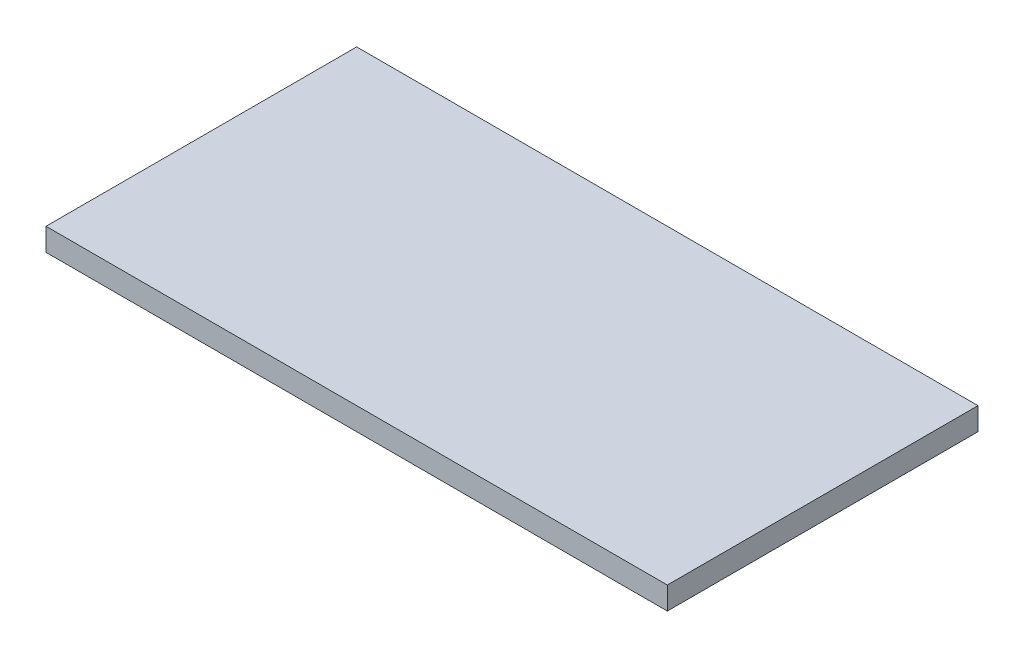
ISO-10303-21;
HEADER;
FILE_DESCRIPTION(('STEP AP214'),'2;1');
FILE_NAME('part.step','',(''),(''),'','','');
FILE_SCHEMA(('AUTOMOTIVE_DESIGN { 1 0 10303 214 1 1 1 1 }'));
ENDSEC;
DATA;
#1=APPLICATION_CONTEXT('core data for automotive mechanical design processes');
#2=APPLICATION_PROTOCOL_DEFINITION('international standard','automotive_design',2000,#1);
#3=PRODUCT_CONTEXT('',#1,'mechanical');
#4=PRODUCT('Part','Part','',(#3));
#5=PRODUCT_RELATED_PRODUCT_CATEGORY('part','',(#4));
#6=PRODUCT_DEFINITION_FORMATION('','',#4);
#7=PRODUCT_DEFINITION_CONTEXT('part definition',#1,'design');
#8=PRODUCT_DEFINITION('design','',#6,#7);
#9=PRODUCT_DEFINITION_SHAPE('','',#8);
#10=(LENGTH_UNIT() NAMED_UNIT(*) SI_UNIT(.MILLI.,.METRE.));
#11=(NAMED_UNIT(*) PLANE_ANGLE_UNIT() SI_UNIT($,.RADIAN.));
#12=(NAMED_UNIT(*) SI_UNIT($,.STERADIAN.) SOLID_ANGLE_UNIT());
#13=UNCERTAINTY_MEASURE_WITH_UNIT(LENGTH_MEASURE(1.E-05),#10,'distance_accuracy_value','');
#14=(GEOMETRIC_REPRESENTATION_CONTEXT(3) GLOBAL_UNCERTAINTY_ASSIGNED_CONTEXT((#13)) GLOBAL_UNIT_ASSIGNED_CONTEXT((#10,
#11,#12)) REPRESENTATION_CONTEXT('',''));
#15=CARTESIAN_POINT('',(0.,0.,0.));
#16=DIRECTION('',(0.,0.,1.));
#17=DIRECTION('',(1.,0.,0.));
#18=AXIS2_PLACEMENT_3D('',#15,#16,#17);
#19=CARTESIAN_POINT('',(55.,2.,-27.5));
#20=DIRECTION('',(-1.,0.,0.));
#21=DIRECTION('',(0.,0.,1.));
#22=AXIS2_PLACEMENT_3D('',#19,#20,#21);
#23=PLANE('',#22);
#24=DIRECTION('',(0.,0.,-1.));
#25=VECTOR('',#24,1.);
#26=CARTESIAN_POINT('',(55.,-2.,-27.5));
#27=LINE('',#26,#25);
#28=CARTESIAN_POINT('',(55.,-2.,27.5));
#29=VERTEX_POINT('',#28);
#30=CARTESIAN_POINT('',(55.,-2.,-27.5));
#31=VERTEX_POINT('',#30);
#32=EDGE_CURVE('E96',#29,#31,#27,.T.);
#33=ORIENTED_EDGE('',*,*,#32,.T.);
#34=DIRECTION('',(0.,-1.,0.));
#35=VECTOR('',#34,1.);
#36=CARTESIAN_POINT('',(55.,2.,-27.5));
#37=LINE('',#36,#35);
#38=CARTESIAN_POINT('',(55.,2.,-27.5));
#39=VERTEX_POINT('',#38);
#40=EDGE_CURVE('E11',#39,#31,#37,.T.);
#41=ORIENTED_EDGE('',*,*,#40,.F.);
#42=DIRECTION('',(0.,0.,-1.));
#43=VECTOR('',#42,1.);
#44=CARTESIAN_POINT('',(55.,2.,-27.5));
#45=LINE('',#44,#43);
#46=CARTESIAN_POINT('',(55.,2.,27.5));
#47=VERTEX_POINT('',#46);
#48=EDGE_CURVE('E84',#47,#39,#45,.T.);
#49=ORIENTED_EDGE('',*,*,#48,.F.);
#50=DIRECTION('',(0.,-1.,0.));
#51=VECTOR('',#50,1.);
#52=CARTESIAN_POINT('',(55.,2.,27.5));
#53=LINE('',#52,#51);
#54=EDGE_CURVE('E92',#47,#29,#53,.T.);
#55=ORIENTED_EDGE('',*,*,#54,.T.);
#56=EDGE_LOOP('',(#33,#41,#49,#55));
#57=FACE_BOUND('',#56,.T.);
#58=ADVANCED_FACE('F33',(#57),#23,.F.);
#59=CARTESIAN_POINT('',(-55.,2.,-27.5));
#60=DIRECTION('',(0.,0.,1.));
#61=DIRECTION('',(1.,0.,0.));
#62=AXIS2_PLACEMENT_3D('',#59,#60,#61);
#63=PLANE('',#62);
#64=DIRECTION('',(-1.,0.,0.));
#65=VECTOR('',#64,1.);
#66=CARTESIAN_POINT('',(-55.,-2.,-27.5));
#67=LINE('',#66,#65);
#68=CARTESIAN_POINT('',(-55.,-2.,-27.5));
#69=VERTEX_POINT('',#68);
#70=EDGE_CURVE('E88',#31,#69,#67,.T.);
#71=ORIENTED_EDGE('',*,*,#70,.T.);
#72=DIRECTION('',(0.,-1.,0.));
#73=VECTOR('',#72,1.);
#74=CARTESIAN_POINT('',(-55.,2.,-27.5));
#75=LINE('',#74,#73);
#76=CARTESIAN_POINT('',(-55.,2.,-27.5));
#77=VERTEX_POINT('',#76);
#78=EDGE_CURVE('E41',#77,#69,#75,.T.);
#79=ORIENTED_EDGE('',*,*,#78,.F.);
#80=DIRECTION('',(-1.,0.,0.));
#81=VECTOR('',#80,1.);
#82=CARTESIAN_POINT('',(-55.,2.,-27.5));
#83=LINE('',#82,#81);
#84=EDGE_CURVE('E79',#39,#77,#83,.T.);
#85=ORIENTED_EDGE('',*,*,#84,.F.);
#86=ORIENTED_EDGE('',*,*,#40,.T.);
#87=EDGE_LOOP('',(#71,#79,#85,#86));
#88=FACE_BOUND('',#87,.T.);
#89=ADVANCED_FACE('F87',(#88),#63,.F.);
#90=CARTESIAN_POINT('',(-55.,2.,-27.5));
#91=DIRECTION('',(1.,0.,0.));
#92=DIRECTION('',(0.,0.,-1.));
#93=AXIS2_PLACEMENT_3D('',#90,#91,#92);
#94=PLANE('',#93);
#95=DIRECTION('',(0.,0.,1.));
#96=VECTOR('',#95,1.);
#97=CARTESIAN_POINT('',(-55.,-2.,-27.5));
#98=LINE('',#97,#96);
#99=CARTESIAN_POINT('',(-55.,-2.,27.5));
#100=VERTEX_POINT('',#99);
#101=EDGE_CURVE('E66',#69,#100,#98,.T.);
#102=ORIENTED_EDGE('',*,*,#101,.T.);
#103=DIRECTION('',(0.,-1.,0.));
#104=VECTOR('',#103,1.);
#105=CARTESIAN_POINT('',(-55.,2.,27.5));
#106=LINE('',#105,#104);
#107=CARTESIAN_POINT('',(-55.,2.,27.5));
#108=VERTEX_POINT('',#107);
#109=EDGE_CURVE('E89',#108,#100,#106,.T.);
#110=ORIENTED_EDGE('',*,*,#109,.F.);
#111=DIRECTION('',(0.,0.,1.));
#112=VECTOR('',#111,1.);
#113=CARTESIAN_POINT('',(-55.,2.,-27.5));
#114=LINE('',#113,#112);
#115=EDGE_CURVE('E82',#77,#108,#114,.T.);
#116=ORIENTED_EDGE('',*,*,#115,.F.);
#117=ORIENTED_EDGE('',*,*,#78,.T.);
#118=EDGE_LOOP('',(#102,#110,#116,#117));
#119=FACE_BOUND('',#118,.T.);
#120=ADVANCED_FACE('F90',(#119),#94,.F.);
#121=CARTESIAN_POINT('',(-55.,2.,27.5));
#122=DIRECTION('',(0.,0.,-1.));
#123=DIRECTION('',(-1.,0.,0.));
#124=AXIS2_PLACEMENT_3D('',#121,#122,#123);
#125=PLANE('',#124);
#126=DIRECTION('',(1.,0.,0.));
#127=VECTOR('',#126,1.);
#128=CARTESIAN_POINT('',(-55.,-2.,27.5));
#129=LINE('',#128,#127);
#130=EDGE_CURVE('E72',#100,#29,#129,.T.);
#131=ORIENTED_EDGE('',*,*,#130,.T.);
#132=ORIENTED_EDGE('',*,*,#54,.F.);
#133=DIRECTION('',(1.,0.,0.));
#134=VECTOR('',#133,1.);
#135=CARTESIAN_POINT('',(-55.,2.,27.5));
#136=LINE('',#135,#134);
#137=EDGE_CURVE('E49',#108,#47,#136,.T.);
#138=ORIENTED_EDGE('',*,*,#137,.F.);
#139=ORIENTED_EDGE('',*,*,#109,.T.);
#140=EDGE_LOOP('',(#131,#132,#138,#139));
#141=FACE_BOUND('',#140,.T.);
#142=ADVANCED_FACE('F103',(#141),#125,.F.);
#143=CARTESIAN_POINT('',(0.,2.,0.));
#144=DIRECTION('',(0.,1.,0.));
#145=DIRECTION('',(0.,0.,1.));
#146=AXIS2_PLACEMENT_3D('',#143,#144,#145);
#147=PLANE('',#146);
#148=ORIENTED_EDGE('',*,*,#48,.T.);
#149=ORIENTED_EDGE('',*,*,#84,.T.);
#150=ORIENTED_EDGE('',*,*,#115,.T.);
#151=ORIENTED_EDGE('',*,*,#137,.T.);
#152=EDGE_LOOP('',(#148,#149,#150,#151));
#153=FACE_BOUND('',#152,.T.);
#154=ADVANCED_FACE('F80',(#153),#147,.T.);
#155=CARTESIAN_POINT('',(0.,-2.,0.));
#156=DIRECTION('',(0.,1.,0.));
#157=DIRECTION('',(0.,0.,1.));
#158=AXIS2_PLACEMENT_3D('',#155,#156,#157);
#159=PLANE('',#158);
#160=ORIENTED_EDGE('',*,*,#32,.F.);
#161=ORIENTED_EDGE('',*,*,#130,.F.);
#162=ORIENTED_EDGE('',*,*,#101,.F.);
#163=ORIENTED_EDGE('',*,*,#70,.F.);
#164=EDGE_LOOP('',(#160,#161,#162,#163));
#165=FACE_BOUND('',#164,.T.);
#166=ADVANCED_FACE('F106',(#165),#159,.F.);
#167=CLOSED_SHELL('',(#58,#89,#120,#142,#154,#166));
#168=MANIFOLD_SOLID_BREP('B2',#167);
#169=ADVANCED_BREP_SHAPE_REPRESENTATION('',(#18,#168),#14);
#170=SHAPE_DEFINITION_REPRESENTATION(#9,#169);
ENDSEC;
END-ISO-10303-21;
